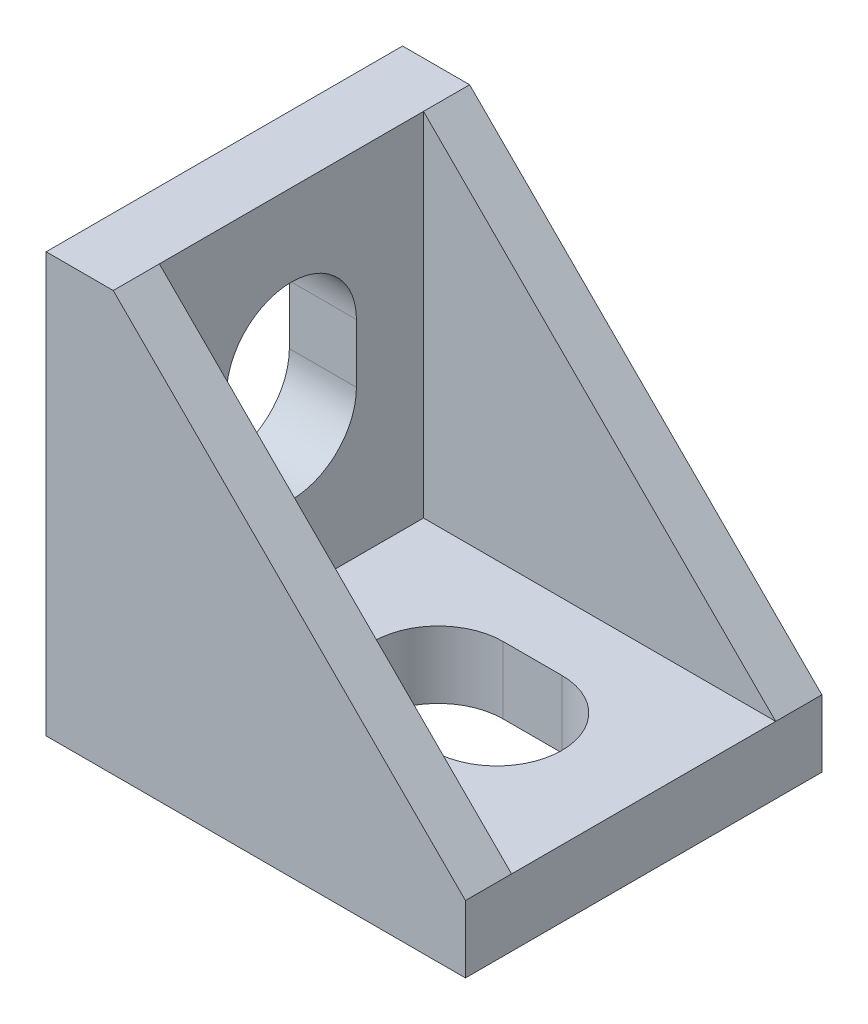
ISO-10303-21;
HEADER;
FILE_DESCRIPTION(('STEP AP214'),'2;1');
FILE_NAME('part.step','',(''),(''),'','','');
FILE_SCHEMA(('AUTOMOTIVE_DESIGN { 1 0 10303 214 1 1 1 1 }'));
ENDSEC;
DATA;
#1=APPLICATION_CONTEXT('core data for automotive mechanical design processes');
#2=APPLICATION_PROTOCOL_DEFINITION('international standard','automotive_design',2000,#1);
#3=PRODUCT_CONTEXT('',#1,'mechanical');
#4=PRODUCT('Part','Part','',(#3));
#5=PRODUCT_RELATED_PRODUCT_CATEGORY('part','',(#4));
#6=PRODUCT_DEFINITION_FORMATION('','',#4);
#7=PRODUCT_DEFINITION_CONTEXT('part definition',#1,'design');
#8=PRODUCT_DEFINITION('design','',#6,#7);
#9=PRODUCT_DEFINITION_SHAPE('','',#8);
#10=(LENGTH_UNIT() NAMED_UNIT(*) SI_UNIT(.MILLI.,.METRE.));
#11=(NAMED_UNIT(*) PLANE_ANGLE_UNIT() SI_UNIT($,.RADIAN.));
#12=(NAMED_UNIT(*) SI_UNIT($,.STERADIAN.) SOLID_ANGLE_UNIT());
#13=UNCERTAINTY_MEASURE_WITH_UNIT(LENGTH_MEASURE(1.E-05),#10,'distance_accuracy_value','');
#14=(GEOMETRIC_REPRESENTATION_CONTEXT(3) GLOBAL_UNCERTAINTY_ASSIGNED_CONTEXT((#13)) GLOBAL_UNIT_ASSIGNED_CONTEXT((#10,
#11,#12)) REPRESENTATION_CONTEXT('',''));
#15=CARTESIAN_POINT('',(0.,0.,0.));
#16=DIRECTION('',(0.,0.,1.));
#17=DIRECTION('',(1.,0.,0.));
#18=AXIS2_PLACEMENT_3D('',#15,#16,#17);
#19=CARTESIAN_POINT('',(-9.99999999999999,-10.,17.));
#20=DIRECTION('',(0.,1.,0.));
#21=DIRECTION('',(-1.,0.,0.));
#22=AXIS2_PLACEMENT_3D('',#19,#20,#21);
#23=PLANE('',#22);
#24=DIRECTION('',(1.,0.,0.));
#25=VECTOR('',#24,1.);
#26=CARTESIAN_POINT('',(-9.99999999999999,-10.,0.));
#27=LINE('',#26,#25);
#28=CARTESIAN_POINT('',(-9.99999999999999,-10.,0.));
#29=VERTEX_POINT('',#28);
#30=CARTESIAN_POINT('',(10.,-10.,0.));
#31=VERTEX_POINT('',#30);
#32=EDGE_CURVE('E257',#29,#31,#27,.T.);
#33=ORIENTED_EDGE('',*,*,#32,.T.);
#34=DIRECTION('',(0.,0.,-1.));
#35=VECTOR('',#34,1.);
#36=CARTESIAN_POINT('',(10.,-10.,17.));
#37=LINE('',#36,#35);
#38=CARTESIAN_POINT('',(10.,-10.,17.));
#39=VERTEX_POINT('',#38);
#40=EDGE_CURVE('E263',#39,#31,#37,.T.);
#41=ORIENTED_EDGE('',*,*,#40,.F.);
#42=DIRECTION('',(1.,0.,0.));
#43=VECTOR('',#42,1.);
#44=CARTESIAN_POINT('',(-9.99999999999999,-10.,17.));
#45=LINE('',#44,#43);
#46=CARTESIAN_POINT('',(-9.99999999999999,-10.,17.));
#47=VERTEX_POINT('',#46);
#48=EDGE_CURVE('E261',#47,#39,#45,.T.);
#49=ORIENTED_EDGE('',*,*,#48,.F.);
#50=DIRECTION('',(0.,0.,-1.));
#51=VECTOR('',#50,1.);
#52=CARTESIAN_POINT('',(-9.99999999999999,-10.,17.));
#53=LINE('',#52,#51);
#54=EDGE_CURVE('E44',#47,#29,#53,.T.);
#55=ORIENTED_EDGE('',*,*,#54,.T.);
#56=EDGE_LOOP('',(#33,#41,#49,#55));
#57=FACE_BOUND('',#56,.T.);
#58=CARTESIAN_POINT('',(0.200000000000006,-10.,8.5));
#59=DIRECTION('',(0.,1.,0.));
#60=DIRECTION('',(-1.,0.,0.));
#61=AXIS2_PLACEMENT_3D('',#58,#59,#60);
#62=CIRCLE('',#61,3.1);
#63=CARTESIAN_POINT('',(0.200000000000006,-10.,11.6));
#64=VERTEX_POINT('',#63);
#65=CARTESIAN_POINT('',(0.200000000000006,-10.,5.4));
#66=VERTEX_POINT('',#65);
#67=EDGE_CURVE('E181',#64,#66,#62,.F.);
#68=ORIENTED_EDGE('',*,*,#67,.F.);
#69=DIRECTION('',(-1.,0.,0.));
#70=VECTOR('',#69,1.);
#71=CARTESIAN_POINT('',(-9.99999999999999,-10.,11.6));
#72=LINE('',#71,#70);
#73=CARTESIAN_POINT('',(3.00000000000002,-10.,11.6));
#74=VERTEX_POINT('',#73);
#75=EDGE_CURVE('E174',#74,#64,#72,.T.);
#76=ORIENTED_EDGE('',*,*,#75,.F.);
#77=CARTESIAN_POINT('',(3.00000000000001,-10.,8.5));
#78=DIRECTION('',(0.,1.,0.));
#79=DIRECTION('',(-1.,0.,0.));
#80=AXIS2_PLACEMENT_3D('',#77,#78,#79);
#81=CIRCLE('',#80,3.1);
#82=CARTESIAN_POINT('',(3.00000000000001,-10.,5.4));
#83=VERTEX_POINT('',#82);
#84=EDGE_CURVE('E155',#83,#74,#81,.F.);
#85=ORIENTED_EDGE('',*,*,#84,.F.);
#86=DIRECTION('',(1.,0.,0.));
#87=VECTOR('',#86,1.);
#88=CARTESIAN_POINT('',(-9.99999999999999,-10.,5.4));
#89=LINE('',#88,#87);
#90=EDGE_CURVE('E179',#66,#83,#89,.T.);
#91=ORIENTED_EDGE('',*,*,#90,.F.);
#92=EDGE_LOOP('',(#68,#76,#85,#91));
#93=FACE_BOUND('',#92,.T.);
#94=ADVANCED_FACE('F36',(#57,#93),#23,.F.);
#95=CARTESIAN_POINT('',(0.,-6.8,0.));
#96=DIRECTION('',(0.,1.,0.));
#97=DIRECTION('',(-1.,0.,0.));
#98=AXIS2_PLACEMENT_3D('',#95,#96,#97);
#99=PLANE('',#98);
#100=DIRECTION('',(1.,0.,0.));
#101=VECTOR('',#100,1.);
#102=CARTESIAN_POINT('',(0.,-6.8,2.2));
#103=LINE('',#102,#101);
#104=CARTESIAN_POINT('',(-6.8,-6.8,2.2));
#105=VERTEX_POINT('',#104);
#106=CARTESIAN_POINT('',(10.,-6.8,2.2));
#107=VERTEX_POINT('',#106);
#108=EDGE_CURVE('E234',#105,#107,#103,.T.);
#109=ORIENTED_EDGE('',*,*,#108,.F.);
#110=DIRECTION('',(0.,0.,-1.));
#111=VECTOR('',#110,1.);
#112=CARTESIAN_POINT('',(-6.8,-6.8,0.));
#113=LINE('',#112,#111);
#114=CARTESIAN_POINT('',(-6.8,-6.8,14.8));
#115=VERTEX_POINT('',#114);
#116=EDGE_CURVE('E237',#115,#105,#113,.T.);
#117=ORIENTED_EDGE('',*,*,#116,.F.);
#118=DIRECTION('',(-1.,0.,0.));
#119=VECTOR('',#118,1.);
#120=CARTESIAN_POINT('',(0.,-6.8,14.8));
#121=LINE('',#120,#119);
#122=CARTESIAN_POINT('',(10.,-6.8,14.8));
#123=VERTEX_POINT('',#122);
#124=EDGE_CURVE('E239',#123,#115,#121,.T.);
#125=ORIENTED_EDGE('',*,*,#124,.F.);
#126=DIRECTION('',(0.,0.,-1.));
#127=VECTOR('',#126,1.);
#128=CARTESIAN_POINT('',(10.,-6.8,0.));
#129=LINE('',#128,#127);
#130=EDGE_CURVE('E241',#123,#107,#129,.T.);
#131=ORIENTED_EDGE('',*,*,#130,.T.);
#132=EDGE_LOOP('',(#109,#117,#125,#131));
#133=FACE_BOUND('',#132,.T.);
#134=DIRECTION('',(-1.,0.,0.));
#135=VECTOR('',#134,1.);
#136=CARTESIAN_POINT('',(0.200000000000003,-6.8,11.6));
#137=LINE('',#136,#135);
#138=CARTESIAN_POINT('',(3.,-6.8,11.6));
#139=VERTEX_POINT('',#138);
#140=CARTESIAN_POINT('',(0.200000000000003,-6.8,11.6));
#141=VERTEX_POINT('',#140);
#142=EDGE_CURVE('E161',#139,#141,#137,.T.);
#143=ORIENTED_EDGE('',*,*,#142,.T.);
#144=CARTESIAN_POINT('',(0.200000000000003,-6.8,8.5));
#145=DIRECTION('',(0.,-1.,0.));
#146=DIRECTION('',(1.,0.,0.));
#147=AXIS2_PLACEMENT_3D('',#144,#145,#146);
#148=CIRCLE('',#147,3.1);
#149=CARTESIAN_POINT('',(0.200000000000003,-6.8,5.4));
#150=VERTEX_POINT('',#149);
#151=EDGE_CURVE('E59',#141,#150,#148,.T.);
#152=ORIENTED_EDGE('',*,*,#151,.T.);
#153=DIRECTION('',(1.,0.,0.));
#154=VECTOR('',#153,1.);
#155=CARTESIAN_POINT('',(0.200000000000003,-6.8,5.4));
#156=LINE('',#155,#154);
#157=CARTESIAN_POINT('',(3.,-6.8,5.4));
#158=VERTEX_POINT('',#157);
#159=EDGE_CURVE('E167',#150,#158,#156,.T.);
#160=ORIENTED_EDGE('',*,*,#159,.T.);
#161=CARTESIAN_POINT('',(3.,-6.8,8.5));
#162=DIRECTION('',(0.,-1.,0.));
#163=DIRECTION('',(-1.,0.,0.));
#164=AXIS2_PLACEMENT_3D('',#161,#162,#163);
#165=CIRCLE('',#164,3.1);
#166=EDGE_CURVE('E152',#158,#139,#165,.T.);
#167=ORIENTED_EDGE('',*,*,#166,.T.);
#168=EDGE_LOOP('',(#143,#152,#160,#167));
#169=FACE_BOUND('',#168,.T.);
#170=ADVANCED_FACE('F165',(#133,#169),#99,.T.);
#171=CARTESIAN_POINT('',(10.,-10.,17.));
#172=DIRECTION('',(-1.,0.,0.));
#173=DIRECTION('',(0.,0.,1.));
#174=AXIS2_PLACEMENT_3D('',#171,#172,#173);
#175=PLANE('',#174);
#176=DIRECTION('',(0.,0.,-1.));
#177=VECTOR('',#176,1.);
#178=CARTESIAN_POINT('',(10.,-6.8,19.));
#179=LINE('',#178,#177);
#180=CARTESIAN_POINT('',(10.,-6.8,17.));
#181=VERTEX_POINT('',#180);
#182=EDGE_CURVE('E217',#181,#123,#179,.T.);
#183=ORIENTED_EDGE('',*,*,#182,.F.);
#184=DIRECTION('',(0.,1.,0.));
#185=VECTOR('',#184,1.);
#186=CARTESIAN_POINT('',(10.,-10.,17.));
#187=LINE('',#186,#185);
#188=EDGE_CURVE('E253',#39,#181,#187,.T.);
#189=ORIENTED_EDGE('',*,*,#188,.F.);
#190=ORIENTED_EDGE('',*,*,#40,.T.);
#191=DIRECTION('',(0.,1.,0.));
#192=VECTOR('',#191,1.);
#193=CARTESIAN_POINT('',(10.,-10.,0.));
#194=LINE('',#193,#192);
#195=CARTESIAN_POINT('',(10.,-6.8,0.));
#196=VERTEX_POINT('',#195);
#197=EDGE_CURVE('E250',#31,#196,#194,.T.);
#198=ORIENTED_EDGE('',*,*,#197,.T.);
#199=EDGE_CURVE('E215',#107,#196,#179,.T.);
#200=ORIENTED_EDGE('',*,*,#199,.F.);
#201=ORIENTED_EDGE('',*,*,#130,.F.);
#202=EDGE_LOOP('',(#183,#189,#190,#198,#200,#201));
#203=FACE_BOUND('',#202,.T.);
#204=ADVANCED_FACE('F38',(#203),#175,.F.);
#205=CARTESIAN_POINT('',(-10.,10.,17.));
#206=DIRECTION('',(0.,-1.,0.));
#207=DIRECTION('',(1.,0.,0.));
#208=AXIS2_PLACEMENT_3D('',#205,#206,#207);
#209=PLANE('',#208);
#210=DIRECTION('',(0.,0.,-1.));
#211=VECTOR('',#210,1.);
#212=CARTESIAN_POINT('',(-6.8,10.,19.));
#213=LINE('',#212,#211);
#214=CARTESIAN_POINT('',(-6.8,10.,2.2));
#215=VERTEX_POINT('',#214);
#216=CARTESIAN_POINT('',(-6.8,10.,0.));
#217=VERTEX_POINT('',#216);
#218=EDGE_CURVE('E218',#215,#217,#213,.T.);
#219=ORIENTED_EDGE('',*,*,#218,.T.);
#220=DIRECTION('',(-1.,0.,0.));
#221=VECTOR('',#220,1.);
#222=CARTESIAN_POINT('',(-10.,10.,0.));
#223=LINE('',#222,#221);
#224=CARTESIAN_POINT('',(-10.,10.,0.));
#225=VERTEX_POINT('',#224);
#226=EDGE_CURVE('E266',#217,#225,#223,.T.);
#227=ORIENTED_EDGE('',*,*,#226,.T.);
#228=DIRECTION('',(0.,0.,-1.));
#229=VECTOR('',#228,1.);
#230=CARTESIAN_POINT('',(-10.,10.,17.));
#231=LINE('',#230,#229);
#232=CARTESIAN_POINT('',(-10.,10.,17.));
#233=VERTEX_POINT('',#232);
#234=EDGE_CURVE('E11',#233,#225,#231,.T.);
#235=ORIENTED_EDGE('',*,*,#234,.F.);
#236=DIRECTION('',(-1.,0.,0.));
#237=VECTOR('',#236,1.);
#238=CARTESIAN_POINT('',(-10.,10.,17.));
#239=LINE('',#238,#237);
#240=CARTESIAN_POINT('',(-6.8,10.,17.));
#241=VERTEX_POINT('',#240);
#242=EDGE_CURVE('E256',#241,#233,#239,.T.);
#243=ORIENTED_EDGE('',*,*,#242,.F.);
#244=CARTESIAN_POINT('',(-6.8,10.,14.8));
#245=VERTEX_POINT('',#244);
#246=EDGE_CURVE('E221',#241,#245,#213,.T.);
#247=ORIENTED_EDGE('',*,*,#246,.T.);
#248=DIRECTION('',(0.,0.,-1.));
#249=VECTOR('',#248,1.);
#250=CARTESIAN_POINT('',(-6.8,10.,0.));
#251=LINE('',#250,#249);
#252=EDGE_CURVE('E233',#245,#215,#251,.T.);
#253=ORIENTED_EDGE('',*,*,#252,.T.);
#254=EDGE_LOOP('',(#219,#227,#235,#243,#247,#253));
#255=FACE_BOUND('',#254,.T.);
#256=ADVANCED_FACE('F298',(#255),#209,.F.);
#257=CARTESIAN_POINT('',(0.,0.,17.));
#258=DIRECTION('',(0.,0.,-1.));
#259=DIRECTION('',(-1.,0.,0.));
#260=AXIS2_PLACEMENT_3D('',#257,#258,#259);
#261=PLANE('',#260);
#262=DIRECTION('',(0.707106781186548,-0.707106781186548,0.));
#263=VECTOR('',#262,1.);
#264=CARTESIAN_POINT('',(1.6,1.6,17.));
#265=LINE('',#264,#263);
#266=EDGE_CURVE('E231',#241,#181,#265,.T.);
#267=ORIENTED_EDGE('',*,*,#266,.F.);
#268=ORIENTED_EDGE('',*,*,#242,.T.);
#269=DIRECTION('',(0.,-1.,0.));
#270=VECTOR('',#269,1.);
#271=CARTESIAN_POINT('',(-9.99999999999999,-10.,17.));
#272=LINE('',#271,#270);
#273=EDGE_CURVE('E259',#233,#47,#272,.T.);
#274=ORIENTED_EDGE('',*,*,#273,.T.);
#275=ORIENTED_EDGE('',*,*,#48,.T.);
#276=ORIENTED_EDGE('',*,*,#188,.T.);
#277=EDGE_LOOP('',(#267,#268,#274,#275,#276));
#278=FACE_BOUND('',#277,.T.);
#279=ADVANCED_FACE('F293',(#278),#261,.F.);
#280=CARTESIAN_POINT('',(0.,0.,0.));
#281=DIRECTION('',(0.,0.,-1.));
#282=DIRECTION('',(-1.,0.,0.));
#283=AXIS2_PLACEMENT_3D('',#280,#281,#282);
#284=PLANE('',#283);
#285=ORIENTED_EDGE('',*,*,#226,.F.);
#286=DIRECTION('',(0.707106781186548,-0.707106781186548,0.));
#287=VECTOR('',#286,1.);
#288=CARTESIAN_POINT('',(1.6,1.6,0.));
#289=LINE('',#288,#287);
#290=EDGE_CURVE('E228',#217,#196,#289,.T.);
#291=ORIENTED_EDGE('',*,*,#290,.T.);
#292=ORIENTED_EDGE('',*,*,#197,.F.);
#293=ORIENTED_EDGE('',*,*,#32,.F.);
#294=DIRECTION('',(0.,-1.,0.));
#295=VECTOR('',#294,1.);
#296=CARTESIAN_POINT('',(-9.99999999999999,-10.,0.));
#297=LINE('',#296,#295);
#298=EDGE_CURVE('E268',#225,#29,#297,.T.);
#299=ORIENTED_EDGE('',*,*,#298,.F.);
#300=EDGE_LOOP('',(#285,#291,#292,#293,#299));
#301=FACE_BOUND('',#300,.T.);
#302=ADVANCED_FACE('F285',(#301),#284,.T.);
#303=CARTESIAN_POINT('',(0.,-6.8,2.2));
#304=DIRECTION('',(0.,0.,1.));
#305=DIRECTION('',(1.,0.,0.));
#306=AXIS2_PLACEMENT_3D('',#303,#304,#305);
#307=PLANE('',#306);
#308=ORIENTED_EDGE('',*,*,#108,.T.);
#309=DIRECTION('',(-0.707106781186548,0.707106781186548,0.));
#310=VECTOR('',#309,1.);
#311=CARTESIAN_POINT('',(5.,-1.8,2.2));
#312=LINE('',#311,#310);
#313=EDGE_CURVE('E225',#107,#215,#312,.T.);
#314=ORIENTED_EDGE('',*,*,#313,.T.);
#315=DIRECTION('',(0.,1.,0.));
#316=VECTOR('',#315,1.);
#317=CARTESIAN_POINT('',(-6.8,-6.8,2.2));
#318=LINE('',#317,#316);
#319=EDGE_CURVE('E244',#105,#215,#318,.T.);
#320=ORIENTED_EDGE('',*,*,#319,.F.);
#321=EDGE_LOOP('',(#308,#314,#320));
#322=FACE_BOUND('',#321,.T.);
#323=ADVANCED_FACE('F305',(#322),#307,.T.);
#324=CARTESIAN_POINT('',(0.,-6.8,14.8));
#325=DIRECTION('',(0.,0.,-1.));
#326=DIRECTION('',(-1.,0.,0.));
#327=AXIS2_PLACEMENT_3D('',#324,#325,#326);
#328=PLANE('',#327);
#329=DIRECTION('',(0.,1.,0.));
#330=VECTOR('',#329,1.);
#331=CARTESIAN_POINT('',(-6.8,-6.8,14.8));
#332=LINE('',#331,#330);
#333=EDGE_CURVE('E247',#115,#245,#332,.T.);
#334=ORIENTED_EDGE('',*,*,#333,.T.);
#335=DIRECTION('',(0.707106781186548,-0.707106781186548,0.));
#336=VECTOR('',#335,1.);
#337=CARTESIAN_POINT('',(5.,-1.8,14.8));
#338=LINE('',#337,#336);
#339=EDGE_CURVE('E222',#245,#123,#338,.T.);
#340=ORIENTED_EDGE('',*,*,#339,.T.);
#341=ORIENTED_EDGE('',*,*,#124,.T.);
#342=EDGE_LOOP('',(#334,#340,#341));
#343=FACE_BOUND('',#342,.T.);
#344=ADVANCED_FACE('F314',(#343),#328,.T.);
#345=CARTESIAN_POINT('',(-9.99999999999999,-10.,17.));
#346=DIRECTION('',(1.,0.,0.));
#347=DIRECTION('',(0.,1.,0.));
#348=AXIS2_PLACEMENT_3D('',#345,#346,#347);
#349=PLANE('',#348);
#350=DIRECTION('',(0.,-1.,0.));
#351=VECTOR('',#350,1.);
#352=CARTESIAN_POINT('',(-9.99999999999999,-10.,11.6));
#353=LINE('',#352,#351);
#354=CARTESIAN_POINT('',(-10.,3.,11.6));
#355=VERTEX_POINT('',#354);
#356=CARTESIAN_POINT('',(-10.,0.199999999999995,11.6));
#357=VERTEX_POINT('',#356);
#358=EDGE_CURVE('E209',#355,#357,#353,.T.);
#359=ORIENTED_EDGE('',*,*,#358,.T.);
#360=CARTESIAN_POINT('',(-10.,0.199999999999995,8.5));
#361=DIRECTION('',(1.,0.,0.));
#362=DIRECTION('',(0.,1.,0.));
#363=AXIS2_PLACEMENT_3D('',#360,#361,#362);
#364=CIRCLE('',#363,3.1);
#365=CARTESIAN_POINT('',(-10.,0.199999999999995,5.4));
#366=VERTEX_POINT('',#365);
#367=EDGE_CURVE('E212',#357,#366,#364,.T.);
#368=ORIENTED_EDGE('',*,*,#367,.T.);
#369=DIRECTION('',(0.,1.,0.));
#370=VECTOR('',#369,1.);
#371=CARTESIAN_POINT('',(-9.99999999999999,-10.,5.4));
#372=LINE('',#371,#370);
#373=CARTESIAN_POINT('',(-10.,3.,5.4));
#374=VERTEX_POINT('',#373);
#375=EDGE_CURVE('E197',#366,#374,#372,.T.);
#376=ORIENTED_EDGE('',*,*,#375,.T.);
#377=CARTESIAN_POINT('',(-10.,3.,8.5));
#378=DIRECTION('',(1.,0.,0.));
#379=DIRECTION('',(0.,1.,0.));
#380=AXIS2_PLACEMENT_3D('',#377,#378,#379);
#381=CIRCLE('',#380,3.1);
#382=EDGE_CURVE('E206',#374,#355,#381,.T.);
#383=ORIENTED_EDGE('',*,*,#382,.T.);
#384=EDGE_LOOP('',(#359,#368,#376,#383));
#385=FACE_BOUND('',#384,.T.);
#386=ORIENTED_EDGE('',*,*,#298,.T.);
#387=ORIENTED_EDGE('',*,*,#54,.F.);
#388=ORIENTED_EDGE('',*,*,#273,.F.);
#389=ORIENTED_EDGE('',*,*,#234,.T.);
#390=EDGE_LOOP('',(#386,#387,#388,#389));
#391=FACE_BOUND('',#390,.T.);
#392=ADVANCED_FACE('F296',(#385,#391),#349,.F.);
#393=CARTESIAN_POINT('',(-6.8,-6.8,0.));
#394=DIRECTION('',(1.,0.,0.));
#395=DIRECTION('',(0.,1.,0.));
#396=AXIS2_PLACEMENT_3D('',#393,#394,#395);
#397=PLANE('',#396);
#398=CARTESIAN_POINT('',(-6.8,0.199999999999996,8.5));
#399=DIRECTION('',(1.,0.,0.));
#400=DIRECTION('',(0.,1.,0.));
#401=AXIS2_PLACEMENT_3D('',#398,#399,#400);
#402=CIRCLE('',#401,3.1);
#403=CARTESIAN_POINT('',(-6.8,0.199999999999996,11.6));
#404=VERTEX_POINT('',#403);
#405=CARTESIAN_POINT('',(-6.8,0.199999999999994,5.4));
#406=VERTEX_POINT('',#405);
#407=EDGE_CURVE('E183',#404,#406,#402,.T.);
#408=ORIENTED_EDGE('',*,*,#407,.F.);
#409=DIRECTION('',(0.,-1.,0.));
#410=VECTOR('',#409,1.);
#411=CARTESIAN_POINT('',(-6.8,0.199999999999996,11.6));
#412=LINE('',#411,#410);
#413=CARTESIAN_POINT('',(-6.8,3.,11.6));
#414=VERTEX_POINT('',#413);
#415=EDGE_CURVE('E191',#414,#404,#412,.T.);
#416=ORIENTED_EDGE('',*,*,#415,.F.);
#417=CARTESIAN_POINT('',(-6.8,3.,8.5));
#418=DIRECTION('',(1.,0.,0.));
#419=DIRECTION('',(0.,-1.,0.));
#420=AXIS2_PLACEMENT_3D('',#417,#418,#419);
#421=CIRCLE('',#420,3.1);
#422=CARTESIAN_POINT('',(-6.8,3.,5.4));
#423=VERTEX_POINT('',#422);
#424=EDGE_CURVE('E188',#423,#414,#421,.T.);
#425=ORIENTED_EDGE('',*,*,#424,.F.);
#426=DIRECTION('',(0.,1.,0.));
#427=VECTOR('',#426,1.);
#428=CARTESIAN_POINT('',(-6.8,0.199999999999996,5.4));
#429=LINE('',#428,#427);
#430=EDGE_CURVE('E185',#406,#423,#429,.T.);
#431=ORIENTED_EDGE('',*,*,#430,.F.);
#432=EDGE_LOOP('',(#408,#416,#425,#431));
#433=FACE_BOUND('',#432,.T.);
#434=ORIENTED_EDGE('',*,*,#252,.F.);
#435=ORIENTED_EDGE('',*,*,#333,.F.);
#436=ORIENTED_EDGE('',*,*,#116,.T.);
#437=ORIENTED_EDGE('',*,*,#319,.T.);
#438=EDGE_LOOP('',(#434,#435,#436,#437));
#439=FACE_BOUND('',#438,.T.);
#440=ADVANCED_FACE('F308',(#433,#439),#397,.T.);
#441=CARTESIAN_POINT('',(-6.8,10.,19.));
#442=DIRECTION('',(0.707106781186548,0.707106781186548,0.));
#443=DIRECTION('',(-0.707106781186548,0.707106781186548,0.));
#444=AXIS2_PLACEMENT_3D('',#441,#442,#443);
#445=PLANE('',#444);
#446=ORIENTED_EDGE('',*,*,#266,.T.);
#447=ORIENTED_EDGE('',*,*,#182,.T.);
#448=ORIENTED_EDGE('',*,*,#339,.F.);
#449=ORIENTED_EDGE('',*,*,#246,.F.);
#450=EDGE_LOOP('',(#446,#447,#448,#449));
#451=FACE_BOUND('',#450,.T.);
#452=ADVANCED_FACE('F316',(#451),#445,.T.);
#453=ORIENTED_EDGE('',*,*,#218,.F.);
#454=ORIENTED_EDGE('',*,*,#313,.F.);
#455=ORIENTED_EDGE('',*,*,#199,.T.);
#456=ORIENTED_EDGE('',*,*,#290,.F.);
#457=EDGE_LOOP('',(#453,#454,#455,#456));
#458=FACE_BOUND('',#457,.T.);
#459=ADVANCED_FACE('F302',(#458),#445,.T.);
#460=CARTESIAN_POINT('',(-23.6,0.199999999999994,8.5));
#461=DIRECTION('',(1.,0.,0.));
#462=DIRECTION('',(0.,1.,0.));
#463=AXIS2_PLACEMENT_3D('',#460,#461,#462);
#464=CYLINDRICAL_SURFACE('',#463,3.1);
#465=DIRECTION('',(1.,0.,0.));
#466=VECTOR('',#465,1.);
#467=CARTESIAN_POINT('',(-23.6,0.199999999999994,11.6));
#468=LINE('',#467,#466);
#469=EDGE_CURVE('E195',#357,#404,#468,.T.);
#470=ORIENTED_EDGE('',*,*,#469,.T.);
#471=ORIENTED_EDGE('',*,*,#407,.T.);
#472=DIRECTION('',(1.,0.,0.));
#473=VECTOR('',#472,1.);
#474=CARTESIAN_POINT('',(-23.6,0.199999999999994,5.4));
#475=LINE('',#474,#473);
#476=EDGE_CURVE('E194',#366,#406,#475,.T.);
#477=ORIENTED_EDGE('',*,*,#476,.F.);
#478=ORIENTED_EDGE('',*,*,#367,.F.);
#479=EDGE_LOOP('',(#470,#471,#477,#478));
#480=FACE_BOUND('',#479,.T.);
#481=ADVANCED_FACE('F323',(#480),#464,.F.);
#482=CARTESIAN_POINT('',(-23.6,0.199999999999994,11.6));
#483=DIRECTION('',(0.,0.,1.));
#484=DIRECTION('',(1.,0.,0.));
#485=AXIS2_PLACEMENT_3D('',#482,#483,#484);
#486=PLANE('',#485);
#487=DIRECTION('',(1.,0.,0.));
#488=VECTOR('',#487,1.);
#489=CARTESIAN_POINT('',(-23.6,2.99999999999999,11.6));
#490=LINE('',#489,#488);
#491=EDGE_CURVE('E198',#355,#414,#490,.T.);
#492=ORIENTED_EDGE('',*,*,#491,.T.);
#493=ORIENTED_EDGE('',*,*,#415,.T.);
#494=ORIENTED_EDGE('',*,*,#469,.F.);
#495=ORIENTED_EDGE('',*,*,#358,.F.);
#496=EDGE_LOOP('',(#492,#493,#494,#495));
#497=FACE_BOUND('',#496,.T.);
#498=ADVANCED_FACE('F395',(#497),#486,.F.);
#499=CARTESIAN_POINT('',(-23.6,2.99999999999999,8.5));
#500=DIRECTION('',(1.,0.,0.));
#501=DIRECTION('',(0.,1.,0.));
#502=AXIS2_PLACEMENT_3D('',#499,#500,#501);
#503=CYLINDRICAL_SURFACE('',#502,3.1);
#504=DIRECTION('',(1.,0.,0.));
#505=VECTOR('',#504,1.);
#506=CARTESIAN_POINT('',(-23.6,2.99999999999999,5.4));
#507=LINE('',#506,#505);
#508=EDGE_CURVE('E200',#374,#423,#507,.T.);
#509=ORIENTED_EDGE('',*,*,#508,.T.);
#510=ORIENTED_EDGE('',*,*,#424,.T.);
#511=ORIENTED_EDGE('',*,*,#491,.F.);
#512=ORIENTED_EDGE('',*,*,#382,.F.);
#513=EDGE_LOOP('',(#509,#510,#511,#512));
#514=FACE_BOUND('',#513,.T.);
#515=ADVANCED_FACE('F398',(#514),#503,.F.);
#516=CARTESIAN_POINT('',(-23.6,0.199999999999994,5.4));
#517=DIRECTION('',(0.,0.,-1.));
#518=DIRECTION('',(-1.,0.,0.));
#519=AXIS2_PLACEMENT_3D('',#516,#517,#518);
#520=PLANE('',#519);
#521=ORIENTED_EDGE('',*,*,#476,.T.);
#522=ORIENTED_EDGE('',*,*,#430,.T.);
#523=ORIENTED_EDGE('',*,*,#508,.F.);
#524=ORIENTED_EDGE('',*,*,#375,.F.);
#525=EDGE_LOOP('',(#521,#522,#523,#524));
#526=FACE_BOUND('',#525,.T.);
#527=ADVANCED_FACE('F364',(#526),#520,.F.);
#528=CARTESIAN_POINT('',(0.20000000000002,-23.6,8.5));
#529=DIRECTION('',(0.,1.,0.));
#530=DIRECTION('',(-1.,0.,0.));
#531=AXIS2_PLACEMENT_3D('',#528,#529,#530);
#532=CYLINDRICAL_SURFACE('',#531,3.1);
#533=ORIENTED_EDGE('',*,*,#67,.T.);
#534=DIRECTION('',(0.,1.,0.));
#535=VECTOR('',#534,1.);
#536=CARTESIAN_POINT('',(0.20000000000002,-23.6,5.4));
#537=LINE('',#536,#535);
#538=EDGE_CURVE('E172',#66,#150,#537,.T.);
#539=ORIENTED_EDGE('',*,*,#538,.T.);
#540=ORIENTED_EDGE('',*,*,#151,.F.);
#541=DIRECTION('',(0.,1.,0.));
#542=VECTOR('',#541,1.);
#543=CARTESIAN_POINT('',(0.20000000000002,-23.6,11.6));
#544=LINE('',#543,#542);
#545=EDGE_CURVE('E158',#64,#141,#544,.T.);
#546=ORIENTED_EDGE('',*,*,#545,.F.);
#547=EDGE_LOOP('',(#533,#539,#540,#546));
#548=FACE_BOUND('',#547,.T.);
#549=ADVANCED_FACE('F358',(#548),#532,.F.);
#550=CARTESIAN_POINT('',(0.20000000000002,-23.6,5.4));
#551=DIRECTION('',(0.,0.,1.));
#552=DIRECTION('',(1.,0.,0.));
#553=AXIS2_PLACEMENT_3D('',#550,#551,#552);
#554=PLANE('',#553);
#555=ORIENTED_EDGE('',*,*,#90,.T.);
#556=DIRECTION('',(0.,1.,0.));
#557=VECTOR('',#556,1.);
#558=CARTESIAN_POINT('',(3.00000000000002,-23.6,5.4));
#559=LINE('',#558,#557);
#560=EDGE_CURVE('E157',#83,#158,#559,.T.);
#561=ORIENTED_EDGE('',*,*,#560,.T.);
#562=ORIENTED_EDGE('',*,*,#159,.F.);
#563=ORIENTED_EDGE('',*,*,#538,.F.);
#564=EDGE_LOOP('',(#555,#561,#562,#563));
#565=FACE_BOUND('',#564,.T.);
#566=ADVANCED_FACE('F363',(#565),#554,.T.);
#567=CARTESIAN_POINT('',(3.00000000000002,-23.6,8.5));
#568=DIRECTION('',(0.,1.,0.));
#569=DIRECTION('',(-1.,0.,0.));
#570=AXIS2_PLACEMENT_3D('',#567,#568,#569);
#571=CYLINDRICAL_SURFACE('',#570,3.1);
#572=ORIENTED_EDGE('',*,*,#84,.T.);
#573=DIRECTION('',(0.,1.,0.));
#574=VECTOR('',#573,1.);
#575=CARTESIAN_POINT('',(3.00000000000002,-23.6,11.6));
#576=LINE('',#575,#574);
#577=EDGE_CURVE('E51',#74,#139,#576,.T.);
#578=ORIENTED_EDGE('',*,*,#577,.T.);
#579=ORIENTED_EDGE('',*,*,#166,.F.);
#580=ORIENTED_EDGE('',*,*,#560,.F.);
#581=EDGE_LOOP('',(#572,#578,#579,#580));
#582=FACE_BOUND('',#581,.T.);
#583=ADVANCED_FACE('F149',(#582),#571,.F.);
#584=CARTESIAN_POINT('',(0.20000000000002,-23.6,11.6));
#585=DIRECTION('',(0.,0.,-1.));
#586=DIRECTION('',(-1.,0.,0.));
#587=AXIS2_PLACEMENT_3D('',#584,#585,#586);
#588=PLANE('',#587);
#589=ORIENTED_EDGE('',*,*,#75,.T.);
#590=ORIENTED_EDGE('',*,*,#545,.T.);
#591=ORIENTED_EDGE('',*,*,#142,.F.);
#592=ORIENTED_EDGE('',*,*,#577,.F.);
#593=EDGE_LOOP('',(#589,#590,#591,#592));
#594=FACE_BOUND('',#593,.T.);
#595=ADVANCED_FACE('F162',(#594),#588,.T.);
#596=CLOSED_SHELL('',(#94,#170,#204,#256,#279,#302,#323,#344,#392,#440,#452,#459,#481,#498,#515,
#527,#549,#566,#583,#595));
#597=MANIFOLD_SOLID_BREP('B2',#596);
#598=ADVANCED_BREP_SHAPE_REPRESENTATION('',(#18,#597),#14);
#599=SHAPE_DEFINITION_REPRESENTATION(#9,#598);
ENDSEC;
END-ISO-10303-21;
